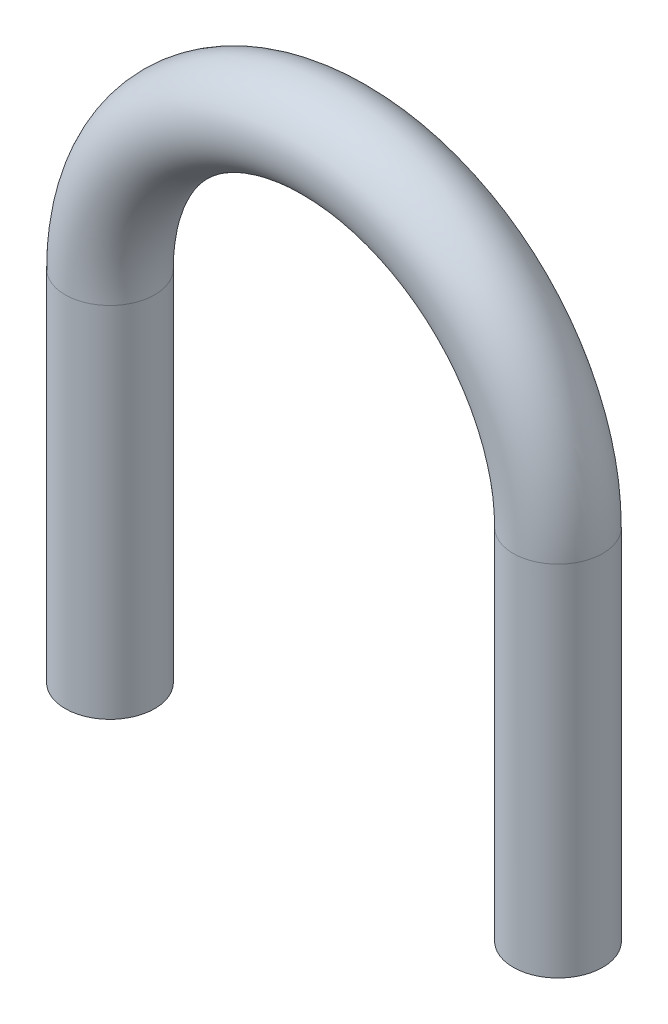
ISO-10303-21;
HEADER;
FILE_DESCRIPTION(('STEP AP214'),'2;1');
FILE_NAME('part.step','',(''),(''),'','','');
FILE_SCHEMA(('AUTOMOTIVE_DESIGN { 1 0 10303 214 1 1 1 1 }'));
ENDSEC;
DATA;
#1=APPLICATION_CONTEXT('core data for automotive mechanical design processes');
#2=APPLICATION_PROTOCOL_DEFINITION('international standard','automotive_design',2000,#1);
#3=PRODUCT_CONTEXT('',#1,'mechanical');
#4=PRODUCT('Part','Part','',(#3));
#5=PRODUCT_RELATED_PRODUCT_CATEGORY('part','',(#4));
#6=PRODUCT_DEFINITION_FORMATION('','',#4);
#7=PRODUCT_DEFINITION_CONTEXT('part definition',#1,'design');
#8=PRODUCT_DEFINITION('design','',#6,#7);
#9=PRODUCT_DEFINITION_SHAPE('','',#8);
#10=(LENGTH_UNIT() NAMED_UNIT(*) SI_UNIT(.MILLI.,.METRE.));
#11=(NAMED_UNIT(*) PLANE_ANGLE_UNIT() SI_UNIT($,.RADIAN.));
#12=(NAMED_UNIT(*) SI_UNIT($,.STERADIAN.) SOLID_ANGLE_UNIT());
#13=UNCERTAINTY_MEASURE_WITH_UNIT(LENGTH_MEASURE(1.E-05),#10,'distance_accuracy_value','');
#14=(GEOMETRIC_REPRESENTATION_CONTEXT(3) GLOBAL_UNCERTAINTY_ASSIGNED_CONTEXT((#13)) GLOBAL_UNIT_ASSIGNED_CONTEXT((#10,
#11,#12)) REPRESENTATION_CONTEXT('',''));
#15=CARTESIAN_POINT('',(0.,0.,0.));
#16=DIRECTION('',(0.,0.,1.));
#17=DIRECTION('',(1.,0.,0.));
#18=AXIS2_PLACEMENT_3D('',#15,#16,#17);
#19=CARTESIAN_POINT('',(-10.,0.,0.));
#20=DIRECTION('',(0.,1.,0.));
#21=DIRECTION('',(0.,0.,1.));
#22=AXIS2_PLACEMENT_3D('',#19,#20,#21);
#23=PLANE('',#22);
#24=CARTESIAN_POINT('',(-10.,0.,0.));
#25=DIRECTION('',(0.,1.,0.));
#26=DIRECTION('',(0.,0.,1.));
#27=AXIS2_PLACEMENT_3D('',#24,#25,#26);
#28=CIRCLE('',#27,2.);
#29=CARTESIAN_POINT('',(-10.,0.,2.));
#30=VERTEX_POINT('',#29);
#31=EDGE_CURVE('E54',#30,#30,#28,.T.);
#32=ORIENTED_EDGE('',*,*,#31,.F.);
#33=EDGE_LOOP('',(#32));
#34=FACE_BOUND('',#33,.T.);
#35=ADVANCED_FACE('F37',(#34),#23,.F.);
#36=CARTESIAN_POINT('',(10.,0.,0.));
#37=DIRECTION('',(0.,-1.,0.));
#38=DIRECTION('',(0.,0.,1.));
#39=AXIS2_PLACEMENT_3D('',#36,#37,#38);
#40=PLANE('',#39);
#41=CARTESIAN_POINT('',(10.,0.,0.));
#42=DIRECTION('',(0.,-1.,0.));
#43=DIRECTION('',(0.,0.,1.));
#44=AXIS2_PLACEMENT_3D('',#41,#42,#43);
#45=CIRCLE('',#44,2.);
#46=CARTESIAN_POINT('',(10.,0.,2.));
#47=VERTEX_POINT('',#46);
#48=EDGE_CURVE('E10',#47,#47,#45,.T.);
#49=ORIENTED_EDGE('',*,*,#48,.T.);
#50=EDGE_LOOP('',(#49));
#51=FACE_BOUND('',#50,.T.);
#52=ADVANCED_FACE('F64',(#51),#40,.T.);
#53=CARTESIAN_POINT('',(-10.,0.,0.));
#54=DIRECTION('',(0.,1.,0.));
#55=DIRECTION('',(0.,0.,1.));
#56=AXIS2_PLACEMENT_3D('',#53,#54,#55);
#57=CYLINDRICAL_SURFACE('',#56,2.);
#58=CARTESIAN_POINT('',(-10.,16.,0.));
#59=DIRECTION('',(0.,1.,0.));
#60=DIRECTION('',(0.,0.,1.));
#61=AXIS2_PLACEMENT_3D('',#58,#59,#60);
#62=CIRCLE('',#61,2.);
#63=CARTESIAN_POINT('',(-12.,16.,0.));
#64=VERTEX_POINT('',#63);
#65=EDGE_CURVE('E49',#64,#64,#62,.T.);
#66=ORIENTED_EDGE('',*,*,#65,.F.);
#67=EDGE_LOOP('',(#66));
#68=FACE_BOUND('',#67,.T.);
#69=ORIENTED_EDGE('',*,*,#31,.T.);
#70=EDGE_LOOP('',(#69));
#71=FACE_BOUND('',#70,.T.);
#72=ADVANCED_FACE('F61',(#68,#71),#57,.T.);
#73=CARTESIAN_POINT('',(0.,16.,0.));
#74=DIRECTION('',(0.,0.,-1.));
#75=DIRECTION('',(-1.,0.,0.));
#76=AXIS2_PLACEMENT_3D('',#73,#74,#75);
#77=TOROIDAL_SURFACE('',#76,10.,2.);
#78=CARTESIAN_POINT('',(10.,16.,0.));
#79=DIRECTION('',(0.,-1.,0.));
#80=DIRECTION('',(0.,0.,1.));
#81=AXIS2_PLACEMENT_3D('',#78,#79,#80);
#82=CIRCLE('',#81,2.);
#83=CARTESIAN_POINT('',(12.,16.,0.));
#84=VERTEX_POINT('',#83);
#85=EDGE_CURVE('E44',#84,#84,#82,.T.);
#86=CARTESIAN_POINT('',(0.,16.,0.));
#87=DIRECTION('',(0.,0.,-1.));
#88=DIRECTION('',(-1.,0.,0.));
#89=AXIS2_PLACEMENT_3D('',#86,#87,#88);
#90=CIRCLE('',#89,12.);
#91=EDGE_CURVE('',#64,#84,#90,.T.);
#92=ORIENTED_EDGE('',*,*,#65,.T.);
#93=ORIENTED_EDGE('',*,*,#85,.F.);
#94=ORIENTED_EDGE('',*,*,#91,.T.);
#95=ORIENTED_EDGE('',*,*,#91,.F.);
#96=EDGE_LOOP('',(#92,#94,#93,#95));
#97=FACE_BOUND('',#96,.T.);
#98=ADVANCED_FACE('F70',(#97),#77,.T.);
#99=CARTESIAN_POINT('',(10.,16.,0.));
#100=DIRECTION('',(0.,-1.,0.));
#101=DIRECTION('',(0.,0.,-1.));
#102=AXIS2_PLACEMENT_3D('',#99,#100,#101);
#103=CYLINDRICAL_SURFACE('',#102,2.);
#104=ORIENTED_EDGE('',*,*,#48,.F.);
#105=EDGE_LOOP('',(#104));
#106=FACE_BOUND('',#105,.T.);
#107=ORIENTED_EDGE('',*,*,#85,.T.);
#108=EDGE_LOOP('',(#107));
#109=FACE_BOUND('',#108,.T.);
#110=ADVANCED_FACE('F68',(#106,#109),#103,.T.);
#111=CLOSED_SHELL('',(#35,#52,#72,#98,#110));
#112=MANIFOLD_SOLID_BREP('B2',#111);
#113=ADVANCED_BREP_SHAPE_REPRESENTATION('',(#18,#112),#14);
#114=SHAPE_DEFINITION_REPRESENTATION(#9,#113);
ENDSEC;
END-ISO-10303-21;
